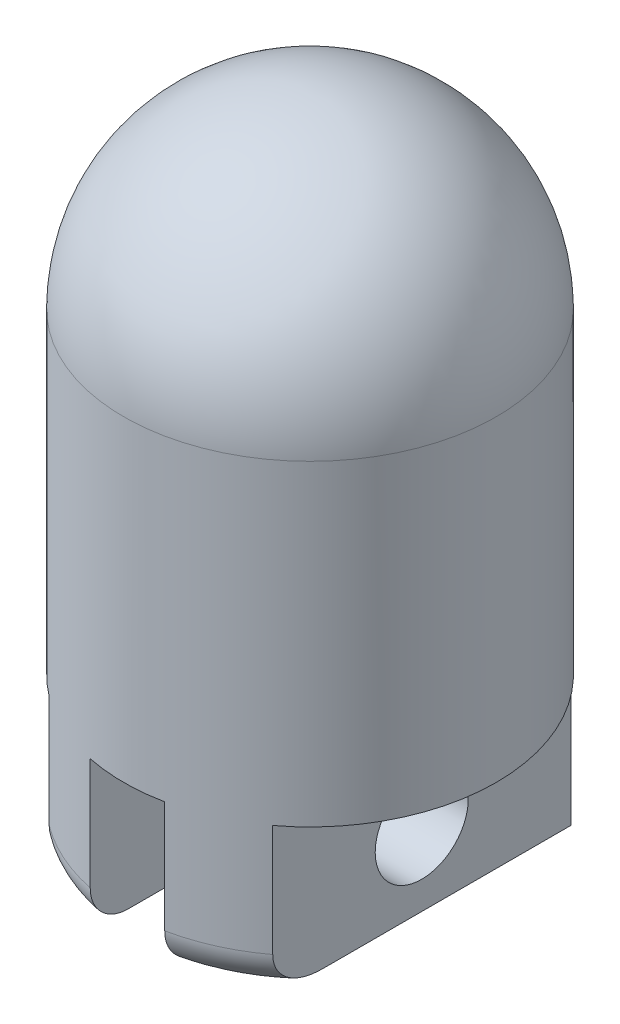
ISO-10303-21;
HEADER;
FILE_DESCRIPTION(('STEP AP214'),'2;1');
FILE_NAME('part.step','',(''),(''),'','','');
FILE_SCHEMA(('AUTOMOTIVE_DESIGN { 1 0 10303 214 1 1 1 1 }'));
ENDSEC;
DATA;
#1=APPLICATION_CONTEXT('core data for automotive mechanical design processes');
#2=APPLICATION_PROTOCOL_DEFINITION('international standard','automotive_design',2000,#1);
#3=PRODUCT_CONTEXT('',#1,'mechanical');
#4=PRODUCT('Part','Part','',(#3));
#5=PRODUCT_RELATED_PRODUCT_CATEGORY('part','',(#4));
#6=PRODUCT_DEFINITION_FORMATION('','',#4);
#7=PRODUCT_DEFINITION_CONTEXT('part definition',#1,'design');
#8=PRODUCT_DEFINITION('design','',#6,#7);
#9=PRODUCT_DEFINITION_SHAPE('','',#8);
#10=(LENGTH_UNIT() NAMED_UNIT(*) SI_UNIT(.MILLI.,.METRE.));
#11=(NAMED_UNIT(*) PLANE_ANGLE_UNIT() SI_UNIT($,.RADIAN.));
#12=(NAMED_UNIT(*) SI_UNIT($,.STERADIAN.) SOLID_ANGLE_UNIT());
#13=UNCERTAINTY_MEASURE_WITH_UNIT(LENGTH_MEASURE(1.E-05),#10,'distance_accuracy_value','');
#14=(GEOMETRIC_REPRESENTATION_CONTEXT(3) GLOBAL_UNCERTAINTY_ASSIGNED_CONTEXT((#13)) GLOBAL_UNIT_ASSIGNED_CONTEXT((#10,
#11,#12)) REPRESENTATION_CONTEXT('',''));
#15=CARTESIAN_POINT('',(0.,0.,0.));
#16=DIRECTION('',(0.,0.,1.));
#17=DIRECTION('',(1.,0.,0.));
#18=AXIS2_PLACEMENT_3D('',#15,#16,#17);
#19=CARTESIAN_POINT('',(0.,0.,0.));
#20=DIRECTION('',(0.,1.,0.));
#21=DIRECTION('',(0.,0.,1.));
#22=AXIS2_PLACEMENT_3D('',#19,#20,#21);
#23=PLANE('',#22);
#24=DIRECTION('',(0.,0.,-1.));
#25=VECTOR('',#24,1.);
#26=CARTESIAN_POINT('',(7.62,0.,10.16));
#27=LINE('',#26,#25);
#28=CARTESIAN_POINT('',(7.62,0.,6.72020833010405));
#29=VERTEX_POINT('',#28);
#30=CARTESIAN_POINT('',(7.62,0.,-10.16));
#31=VERTEX_POINT('',#30);
#32=EDGE_CURVE('E163',#29,#31,#27,.T.);
#33=ORIENTED_EDGE('',*,*,#32,.F.);
#34=CARTESIAN_POINT('',(0.,0.,0.));
#35=DIRECTION('',(0.,1.,0.));
#36=DIRECTION('',(0.,0.,1.));
#37=AXIS2_PLACEMENT_3D('',#34,#35,#36);
#38=CIRCLE('',#37,10.16);
#39=CARTESIAN_POINT('',(2.54,0.,9.83737769936684));
#40=VERTEX_POINT('',#39);
#41=EDGE_CURVE('E285',#29,#40,#38,.F.);
#42=ORIENTED_EDGE('',*,*,#41,.T.);
#43=DIRECTION('',(0.,0.,1.));
#44=VECTOR('',#43,1.);
#45=CARTESIAN_POINT('',(2.54,0.,12.4434078933385));
#46=LINE('',#45,#44);
#47=CARTESIAN_POINT('',(2.54,0.,-12.4434078933385));
#48=VERTEX_POINT('',#47);
#49=EDGE_CURVE('E181',#48,#40,#46,.T.);
#50=ORIENTED_EDGE('',*,*,#49,.F.);
#51=CARTESIAN_POINT('',(0.,0.,0.));
#52=DIRECTION('',(0.,-1.,0.));
#53=DIRECTION('',(0.,0.,-1.));
#54=AXIS2_PLACEMENT_3D('',#51,#52,#53);
#55=CIRCLE('',#54,12.7);
#56=EDGE_CURVE('E212',#48,#31,#55,.T.);
#57=ORIENTED_EDGE('',*,*,#56,.T.);
#58=EDGE_LOOP('',(#33,#42,#50,#57));
#59=FACE_BOUND('',#58,.T.);
#60=ADVANCED_FACE('F39',(#59),#23,.F.);
#61=DIRECTION('',(0.,0.,-1.));
#62=VECTOR('',#61,1.);
#63=CARTESIAN_POINT('',(-2.54,0.,12.4434078933385));
#64=LINE('',#63,#62);
#65=CARTESIAN_POINT('',(-2.54,0.,9.83737769936684));
#66=VERTEX_POINT('',#65);
#67=CARTESIAN_POINT('',(-2.54,0.,-12.4434078933385));
#68=VERTEX_POINT('',#67);
#69=EDGE_CURVE('E155',#66,#68,#64,.T.);
#70=ORIENTED_EDGE('',*,*,#69,.F.);
#71=CARTESIAN_POINT('',(0.,0.,0.));
#72=DIRECTION('',(0.,1.,0.));
#73=DIRECTION('',(0.,0.,1.));
#74=AXIS2_PLACEMENT_3D('',#71,#72,#73);
#75=CIRCLE('',#74,10.16);
#76=CARTESIAN_POINT('',(-7.62,0.,6.72020833010406));
#77=VERTEX_POINT('',#76);
#78=EDGE_CURVE('E234',#66,#77,#75,.F.);
#79=ORIENTED_EDGE('',*,*,#78,.T.);
#80=DIRECTION('',(0.,0.,1.));
#81=VECTOR('',#80,1.);
#82=CARTESIAN_POINT('',(-7.62,0.,10.16));
#83=LINE('',#82,#81);
#84=CARTESIAN_POINT('',(-7.62,0.,-10.16));
#85=VERTEX_POINT('',#84);
#86=EDGE_CURVE('E136',#85,#77,#83,.T.);
#87=ORIENTED_EDGE('',*,*,#86,.F.);
#88=EDGE_CURVE('E151',#85,#68,#55,.T.);
#89=ORIENTED_EDGE('',*,*,#88,.T.);
#90=EDGE_LOOP('',(#70,#79,#87,#89));
#91=FACE_BOUND('',#90,.T.);
#92=ADVANCED_FACE('F337',(#91),#23,.F.);
#93=CARTESIAN_POINT('',(0.,31.75,0.));
#94=DIRECTION('',(0.,-1.,0.));
#95=DIRECTION('',(-1.,0.,0.));
#96=AXIS2_PLACEMENT_3D('',#93,#94,#95);
#97=SPHERICAL_SURFACE('',#96,12.7);
#98=CARTESIAN_POINT('',(0.,31.75,0.));
#99=DIRECTION('',(0.,-1.,0.));
#100=DIRECTION('',(0.,0.,-1.));
#101=AXIS2_PLACEMENT_3D('',#98,#99,#100);
#102=CIRCLE('',#101,12.7);
#103=CARTESIAN_POINT('',(0.,31.75,-12.7));
#104=VERTEX_POINT('',#103);
#105=EDGE_CURVE('E216',#104,#104,#102,.T.);
#106=ORIENTED_EDGE('',*,*,#105,.F.);
#107=EDGE_LOOP('',(#106));
#108=FACE_BOUND('',#107,.T.);
#109=ADVANCED_FACE('F341',(#108),#97,.T.);
#110=CARTESIAN_POINT('',(0.,0.,0.));
#111=DIRECTION('',(0.,-1.,0.));
#112=DIRECTION('',(0.,0.,-1.));
#113=AXIS2_PLACEMENT_3D('',#110,#111,#112);
#114=CYLINDRICAL_SURFACE('',#113,12.7);
#115=DIRECTION('',(0.,-1.,0.));
#116=VECTOR('',#115,1.);
#117=CARTESIAN_POINT('',(-7.62,10.16,10.16));
#118=LINE('',#117,#116);
#119=CARTESIAN_POINT('',(-7.62,10.16,10.16));
#120=VERTEX_POINT('',#119);
#121=CARTESIAN_POINT('',(-7.62,2.54,10.16));
#122=VERTEX_POINT('',#121);
#123=EDGE_CURVE('E143',#120,#122,#118,.T.);
#124=ORIENTED_EDGE('',*,*,#123,.T.);
#125=CARTESIAN_POINT('',(0.,2.54,0.));
#126=DIRECTION('',(0.,1.,0.));
#127=DIRECTION('',(0.,0.,1.));
#128=AXIS2_PLACEMENT_3D('',#125,#126,#127);
#129=CIRCLE('',#128,12.7);
#130=CARTESIAN_POINT('',(-2.54,2.54,12.4434078933385));
#131=VERTEX_POINT('',#130);
#132=EDGE_CURVE('E294',#122,#131,#129,.T.);
#133=ORIENTED_EDGE('',*,*,#132,.T.);
#134=DIRECTION('',(0.,-1.,0.));
#135=VECTOR('',#134,1.);
#136=CARTESIAN_POINT('',(-2.54,10.16,12.4434078933385));
#137=LINE('',#136,#135);
#138=CARTESIAN_POINT('',(-2.54,10.16,12.4434078933385));
#139=VERTEX_POINT('',#138);
#140=EDGE_CURVE('E193',#139,#131,#137,.T.);
#141=ORIENTED_EDGE('',*,*,#140,.F.);
#142=CARTESIAN_POINT('',(0.,10.16,0.));
#143=DIRECTION('',(0.,-1.,0.));
#144=DIRECTION('',(0.,0.,-1.));
#145=AXIS2_PLACEMENT_3D('',#142,#143,#144);
#146=CIRCLE('',#145,12.7);
#147=CARTESIAN_POINT('',(2.54,10.16,12.4434078933385));
#148=VERTEX_POINT('',#147);
#149=EDGE_CURVE('E176',#148,#139,#146,.T.);
#150=ORIENTED_EDGE('',*,*,#149,.F.);
#151=DIRECTION('',(0.,-1.,0.));
#152=VECTOR('',#151,1.);
#153=CARTESIAN_POINT('',(2.54,10.16,12.4434078933385));
#154=LINE('',#153,#152);
#155=CARTESIAN_POINT('',(2.54,2.54,12.4434078933385));
#156=VERTEX_POINT('',#155);
#157=EDGE_CURVE('E199',#148,#156,#154,.T.);
#158=ORIENTED_EDGE('',*,*,#157,.T.);
#159=CARTESIAN_POINT('',(0.,2.54,0.));
#160=DIRECTION('',(0.,1.,0.));
#161=DIRECTION('',(0.,0.,1.));
#162=AXIS2_PLACEMENT_3D('',#159,#160,#161);
#163=CIRCLE('',#162,12.7);
#164=CARTESIAN_POINT('',(7.62,2.54,10.16));
#165=VERTEX_POINT('',#164);
#166=EDGE_CURVE('E246',#156,#165,#163,.T.);
#167=ORIENTED_EDGE('',*,*,#166,.T.);
#168=DIRECTION('',(0.,-1.,0.));
#169=VECTOR('',#168,1.);
#170=CARTESIAN_POINT('',(7.62,10.16,10.16));
#171=LINE('',#170,#169);
#172=CARTESIAN_POINT('',(7.62,10.16,10.16));
#173=VERTEX_POINT('',#172);
#174=EDGE_CURVE('E166',#173,#165,#171,.T.);
#175=ORIENTED_EDGE('',*,*,#174,.F.);
#176=CARTESIAN_POINT('',(0.,10.16,0.));
#177=DIRECTION('',(0.,-1.,0.));
#178=DIRECTION('',(0.,0.,-1.));
#179=AXIS2_PLACEMENT_3D('',#176,#177,#178);
#180=CIRCLE('',#179,12.7);
#181=CARTESIAN_POINT('',(7.62,10.16,-10.16));
#182=VERTEX_POINT('',#181);
#183=EDGE_CURVE('E159',#182,#173,#180,.T.);
#184=ORIENTED_EDGE('',*,*,#183,.F.);
#185=DIRECTION('',(0.,-1.,0.));
#186=VECTOR('',#185,1.);
#187=CARTESIAN_POINT('',(7.62,10.16,-10.16));
#188=LINE('',#187,#186);
#189=EDGE_CURVE('E170',#182,#31,#188,.T.);
#190=ORIENTED_EDGE('',*,*,#189,.T.);
#191=ORIENTED_EDGE('',*,*,#56,.F.);
#192=DIRECTION('',(0.,-1.,0.));
#193=VECTOR('',#192,1.);
#194=CARTESIAN_POINT('',(2.54,10.16,-12.4434078933385));
#195=LINE('',#194,#193);
#196=CARTESIAN_POINT('',(2.54,10.16,-12.4434078933385));
#197=VERTEX_POINT('',#196);
#198=EDGE_CURVE('E203',#197,#48,#195,.T.);
#199=ORIENTED_EDGE('',*,*,#198,.F.);
#200=CARTESIAN_POINT('',(0.,10.16,0.));
#201=DIRECTION('',(0.,-1.,0.));
#202=DIRECTION('',(0.,0.,-1.));
#203=AXIS2_PLACEMENT_3D('',#200,#201,#202);
#204=CIRCLE('',#203,12.7);
#205=CARTESIAN_POINT('',(-2.54,10.16,-12.4434078933385));
#206=VERTEX_POINT('',#205);
#207=EDGE_CURVE('E186',#206,#197,#204,.T.);
#208=ORIENTED_EDGE('',*,*,#207,.F.);
#209=DIRECTION('',(0.,-1.,0.));
#210=VECTOR('',#209,1.);
#211=CARTESIAN_POINT('',(-2.54,10.16,-12.4434078933385));
#212=LINE('',#211,#210);
#213=EDGE_CURVE('E206',#206,#68,#212,.T.);
#214=ORIENTED_EDGE('',*,*,#213,.T.);
#215=ORIENTED_EDGE('',*,*,#88,.F.);
#216=DIRECTION('',(0.,-1.,0.));
#217=VECTOR('',#216,1.);
#218=CARTESIAN_POINT('',(-7.62,10.16,-10.16));
#219=LINE('',#218,#217);
#220=CARTESIAN_POINT('',(-7.62,10.16,-10.16));
#221=VERTEX_POINT('',#220);
#222=EDGE_CURVE('E141',#221,#85,#219,.T.);
#223=ORIENTED_EDGE('',*,*,#222,.F.);
#224=CARTESIAN_POINT('',(0.,10.16,0.));
#225=DIRECTION('',(0.,-1.,0.));
#226=DIRECTION('',(0.,0.,-1.));
#227=AXIS2_PLACEMENT_3D('',#224,#225,#226);
#228=CIRCLE('',#227,12.7);
#229=EDGE_CURVE('E127',#120,#221,#228,.T.);
#230=ORIENTED_EDGE('',*,*,#229,.F.);
#231=EDGE_LOOP('',(#124,#133,#141,#150,#158,#167,#175,#184,#190,#191,#199,#208,#214,#215,#223,#230));
#232=FACE_BOUND('',#231,.T.);
#233=ORIENTED_EDGE('',*,*,#105,.T.);
#234=EDGE_LOOP('',(#233));
#235=FACE_BOUND('',#234,.T.);
#236=ADVANCED_FACE('F147',(#232,#235),#114,.T.);
#237=CARTESIAN_POINT('',(0.,10.16,0.));
#238=DIRECTION('',(0.,-1.,0.));
#239=DIRECTION('',(0.,0.,-1.));
#240=AXIS2_PLACEMENT_3D('',#237,#238,#239);
#241=PLANE('',#240);
#242=CARTESIAN_POINT('',(0.,10.16,0.));
#243=DIRECTION('',(0.,-1.,0.));
#244=DIRECTION('',(0.,0.,-1.));
#245=AXIS2_PLACEMENT_3D('',#242,#243,#244);
#246=CIRCLE('',#245,2.54);
#247=CARTESIAN_POINT('',(-2.54,10.16,0.));
#248=VERTEX_POINT('',#247);
#249=CARTESIAN_POINT('',(2.54,10.16,0.));
#250=VERTEX_POINT('',#249);
#251=EDGE_CURVE('E227',#248,#250,#246,.F.);
#252=ORIENTED_EDGE('',*,*,#251,.T.);
#253=DIRECTION('',(0.,0.,1.));
#254=VECTOR('',#253,1.);
#255=CARTESIAN_POINT('',(2.54,10.16,12.4434078933385));
#256=LINE('',#255,#254);
#257=EDGE_CURVE('E189',#250,#148,#256,.T.);
#258=ORIENTED_EDGE('',*,*,#257,.T.);
#259=ORIENTED_EDGE('',*,*,#149,.T.);
#260=DIRECTION('',(0.,0.,-1.));
#261=VECTOR('',#260,1.);
#262=CARTESIAN_POINT('',(-2.54,10.16,12.4434078933385));
#263=LINE('',#262,#261);
#264=EDGE_CURVE('E182',#139,#248,#263,.T.);
#265=ORIENTED_EDGE('',*,*,#264,.T.);
#266=EDGE_LOOP('',(#252,#258,#259,#265));
#267=FACE_BOUND('',#266,.T.);
#268=ADVANCED_FACE('F267',(#267),#241,.T.);
#269=EDGE_CURVE('E224',#250,#248,#246,.F.);
#270=ORIENTED_EDGE('',*,*,#269,.T.);
#271=EDGE_CURVE('E180',#248,#206,#263,.T.);
#272=ORIENTED_EDGE('',*,*,#271,.T.);
#273=ORIENTED_EDGE('',*,*,#207,.T.);
#274=EDGE_CURVE('E190',#197,#250,#256,.T.);
#275=ORIENTED_EDGE('',*,*,#274,.T.);
#276=EDGE_LOOP('',(#270,#272,#273,#275));
#277=FACE_BOUND('',#276,.T.);
#278=ADVANCED_FACE('F270',(#277),#241,.T.);
#279=CARTESIAN_POINT('',(2.54,10.16,12.4434078933385));
#280=DIRECTION('',(1.,0.,0.));
#281=DIRECTION('',(0.,0.,-1.));
#282=AXIS2_PLACEMENT_3D('',#279,#280,#281);
#283=PLANE('',#282);
#284=CARTESIAN_POINT('',(2.54,5.08,0.));
#285=DIRECTION('',(1.,0.,0.));
#286=DIRECTION('',(0.,0.,-1.));
#287=AXIS2_PLACEMENT_3D('',#284,#285,#286);
#288=CIRCLE('',#287,3.175);
#289=CARTESIAN_POINT('',(2.54,5.08,-3.175));
#290=VERTEX_POINT('',#289);
#291=EDGE_CURVE('E169',#290,#290,#288,.T.);
#292=ORIENTED_EDGE('',*,*,#291,.T.);
#293=EDGE_LOOP('',(#292));
#294=FACE_BOUND('',#293,.T.);
#295=ORIENTED_EDGE('',*,*,#49,.T.);
#296=CARTESIAN_POINT('',(2.54,0.,9.83737769936684));
#297=CARTESIAN_POINT('',(2.54,1.45425618167772E-06,9.91230037919097));
#298=CARTESIAN_POINT('',(2.54,0.00310981694239159,9.98718958698183));
#299=CARTESIAN_POINT('',(2.54,0.0155436658062321,10.1364549391743));
#300=CARTESIAN_POINT('',(2.54,0.02486959755277,10.2108310464197));
#301=CARTESIAN_POINT('',(2.54,0.0621632906921143,10.4324166619154));
#302=CARTESIAN_POINT('',(2.54,0.0994469487679672,10.578173392806));
#303=CARTESIAN_POINT('',(2.54,0.198147270173078,10.8613867869284));
#304=CARTESIAN_POINT('',(2.54,0.259589645281355,10.9988344265028));
#305=CARTESIAN_POINT('',(2.54,0.405105398356876,11.261129326273));
#306=CARTESIAN_POINT('',(2.54,0.48916633258982,11.3859834630861));
#307=CARTESIAN_POINT('',(2.54,0.675862847898282,11.6169487416195));
#308=CARTESIAN_POINT('',(2.54,0.778107822291197,11.7233756291323));
#309=CARTESIAN_POINT('',(2.54,0.999446084232905,11.9170573290163));
#310=CARTESIAN_POINT('',(2.54,1.11854228435804,12.0043088204298));
#311=CARTESIAN_POINT('',(2.54,1.36703211456297,12.1549133561521));
#312=CARTESIAN_POINT('',(2.54,1.49610667508061,12.2187937971196));
#313=CARTESIAN_POINT('',(2.54,1.76323440237714,12.3234975537076));
#314=CARTESIAN_POINT('',(2.54,1.90127928169638,12.3643418234144));
#315=CARTESIAN_POINT('',(2.54,2.12369890518237,12.4097791905788));
#316=CARTESIAN_POINT('',(2.54,2.20651763910892,12.4223841804546));
#317=CARTESIAN_POINT('',(2.54,2.37287781294579,12.4391952140899));
#318=CARTESIAN_POINT('',(2.54,2.45641798662608,12.4434137919833));
#319=CARTESIAN_POINT('',(2.54,2.54,12.4434078933385));
#320=B_SPLINE_CURVE_WITH_KNOTS('',3,(#296,#297,#298,#299,#300,#301,#302,#303,#304,#305,#306,
#307,#308,#309,#310,#311,#312,#313,#314,#315,#316,#317,#318,#319),.UNSPECIFIED.,.F.,.F.,(4,2,2,
2,2,2,2,2,2,2,2,4),(0.,0.224635584073767,0.449287267911123,0.898324217122332,1.34784036920845,
1.79710972118426,2.23769161945873,2.67834976141615,3.10834056745386,3.53793961324235,
3.78887256919796,4.0394302038591),.UNSPECIFIED.);
#321=EDGE_CURVE('E54',#40,#156,#320,.T.);
#322=ORIENTED_EDGE('',*,*,#321,.T.);
#323=ORIENTED_EDGE('',*,*,#157,.F.);
#324=ORIENTED_EDGE('',*,*,#257,.F.);
#325=ORIENTED_EDGE('',*,*,#274,.F.);
#326=ORIENTED_EDGE('',*,*,#198,.T.);
#327=EDGE_LOOP('',(#295,#322,#323,#324,#325,#326));
#328=FACE_BOUND('',#327,.T.);
#329=ADVANCED_FACE('F272',(#294,#328),#283,.F.);
#330=CARTESIAN_POINT('',(-2.54,10.16,12.4434078933385));
#331=DIRECTION('',(-1.,0.,0.));
#332=DIRECTION('',(0.,0.,1.));
#333=AXIS2_PLACEMENT_3D('',#330,#331,#332);
#334=PLANE('',#333);
#335=CARTESIAN_POINT('',(-2.54,5.08,0.));
#336=DIRECTION('',(-1.,0.,0.));
#337=DIRECTION('',(0.,0.,1.));
#338=AXIS2_PLACEMENT_3D('',#335,#336,#337);
#339=CIRCLE('',#338,3.175);
#340=CARTESIAN_POINT('',(-2.54,5.08,3.175));
#341=VERTEX_POINT('',#340);
#342=EDGE_CURVE('E232',#341,#341,#339,.T.);
#343=ORIENTED_EDGE('',*,*,#342,.T.);
#344=EDGE_LOOP('',(#343));
#345=FACE_BOUND('',#344,.T.);
#346=ORIENTED_EDGE('',*,*,#140,.T.);
#347=CARTESIAN_POINT('',(-2.54,2.54,12.4434078933385));
#348=CARTESIAN_POINT('',(-2.54,2.46967063237577,12.4434154470113));
#349=CARTESIAN_POINT('',(-2.54,2.39934485357642,12.4404267278602));
#350=CARTESIAN_POINT('',(-2.54,2.25920319252276,12.4285150367311));
#351=CARTESIAN_POINT('',(-2.54,2.18938726943151,12.4195925454082));
#352=CARTESIAN_POINT('',(-2.54,2.0508429922709,12.3958863873355));
#353=CARTESIAN_POINT('',(-2.54,1.98211338963525,12.3811100493502));
#354=CARTESIAN_POINT('',(-2.54,1.84616156852946,12.3458265144606));
#355=CARTESIAN_POINT('',(-2.54,1.77893934087272,12.3253193524927));
#356=CARTESIAN_POINT('',(-2.54,1.58020157604863,12.2553951049839));
#357=CARTESIAN_POINT('',(-2.54,1.45153515102383,12.1975614990708));
#358=CARTESIAN_POINT('',(-2.54,1.20572174178529,12.0613038825231));
#359=CARTESIAN_POINT('',(-2.54,1.08857431180475,11.982880669105));
#360=CARTESIAN_POINT('',(-2.54,0.867990402614351,11.8070995623068));
#361=CARTESIAN_POINT('',(-2.54,0.764664812840586,11.7096023869722));
#362=CARTESIAN_POINT('',(-2.54,0.575468544765382,11.4989271370242));
#363=CARTESIAN_POINT('',(-2.54,0.489601028382851,11.3857462280823));
#364=CARTESIAN_POINT('',(-2.54,0.335940087501158,11.1446164847891));
#365=CARTESIAN_POINT('',(-2.54,0.268530705758163,11.0164232223069));
#366=CARTESIAN_POINT('',(-2.54,0.155607960316393,10.7507343228132));
#367=CARTESIAN_POINT('',(-2.54,0.110091838523056,10.6132398600497));
#368=CARTESIAN_POINT('',(-2.54,0.0506877983667472,10.3690151979483));
#369=CARTESIAN_POINT('',(-2.54,0.0316698297012548,10.2634985640939));
#370=CARTESIAN_POINT('',(-2.54,0.00632611211670065,10.051121449083));
#371=CARTESIAN_POINT('',(-2.54,-1.98484952771332E-05,9.94426338192671));
#372=CARTESIAN_POINT('',(-2.54,0.,9.83737769936684));
#373=B_SPLINE_CURVE_WITH_KNOTS('',3,(#347,#348,#349,#350,#351,#352,#353,#354,#355,#356,#357,
#358,#359,#360,#361,#362,#363,#364,#365,#366,#367,#368,#369,#370,#371,#372),.UNSPECIFIED.,.F.,
.F.,(4,2,2,2,2,2,2,2,2,2,2,2,4),(0.,0.210918249149259,0.421819415305526,0.632457372480104,
0.843094045585046,1.26412750353444,1.68514466173996,2.10935936996745,2.53365084153177,
2.9661951343593,3.39868492133767,3.71960780058626,4.04001840172957),.UNSPECIFIED.);
#374=EDGE_CURVE('E288',#131,#66,#373,.T.);
#375=ORIENTED_EDGE('',*,*,#374,.T.);
#376=ORIENTED_EDGE('',*,*,#69,.T.);
#377=ORIENTED_EDGE('',*,*,#213,.F.);
#378=ORIENTED_EDGE('',*,*,#271,.F.);
#379=ORIENTED_EDGE('',*,*,#264,.F.);
#380=EDGE_LOOP('',(#346,#375,#376,#377,#378,#379));
#381=FACE_BOUND('',#380,.T.);
#382=ADVANCED_FACE('F255',(#345,#381),#334,.F.);
#383=CARTESIAN_POINT('',(-7.62,10.16,10.16));
#384=DIRECTION('',(1.,0.,0.));
#385=DIRECTION('',(0.,0.,-1.));
#386=AXIS2_PLACEMENT_3D('',#383,#384,#385);
#387=PLANE('',#386);
#388=CARTESIAN_POINT('',(-7.62,5.08,0.));
#389=DIRECTION('',(-1.,0.,0.));
#390=DIRECTION('',(0.,0.,1.));
#391=AXIS2_PLACEMENT_3D('',#388,#389,#390);
#392=CIRCLE('',#391,3.175);
#393=CARTESIAN_POINT('',(-7.62,5.08,3.175));
#394=VERTEX_POINT('',#393);
#395=EDGE_CURVE('E233',#394,#394,#392,.T.);
#396=ORIENTED_EDGE('',*,*,#395,.F.);
#397=EDGE_LOOP('',(#396));
#398=FACE_BOUND('',#397,.T.);
#399=ORIENTED_EDGE('',*,*,#86,.T.);
#400=CARTESIAN_POINT('',(-7.62,0.,6.72020833010406));
#401=CARTESIAN_POINT('',(-7.62,-7.47413466262921E-05,6.99327990287421));
#402=CARTESIAN_POINT('',(-7.62,0.0193476233139782,7.26867863347754));
#403=CARTESIAN_POINT('',(-7.62,0.106175815575614,7.81491676110583));
#404=CARTESIAN_POINT('',(-7.62,0.174158048363266,8.08566098800379));
#405=CARTESIAN_POINT('',(-7.62,0.330202589140558,8.50572625033473));
#406=CARTESIAN_POINT('',(-7.62,0.40038807044519,8.66158064871892));
#407=CARTESIAN_POINT('',(-7.62,0.563805608258863,8.96011014989274));
#408=CARTESIAN_POINT('',(-7.62,0.656936899856236,9.10283922552907));
#409=CARTESIAN_POINT('',(-7.62,0.849628854295138,9.34773236899358));
#410=CARTESIAN_POINT('',(-7.62,0.945607476125319,9.45270636094602));
#411=CARTESIAN_POINT('',(-7.62,1.15378585705436,9.64565066826041));
#412=CARTESIAN_POINT('',(-7.62,1.26599581181159,9.73361021427731));
#413=CARTESIAN_POINT('',(-7.62,1.44529437515778,9.84952483403398));
#414=CARTESIAN_POINT('',(-7.62,1.50721950643727,9.88562806891205));
#415=CARTESIAN_POINT('',(-7.62,1.63422624334214,9.95174325933018));
#416=CARTESIAN_POINT('',(-7.62,1.69930608040803,9.98175857998488));
#417=CARTESIAN_POINT('',(-7.62,1.83201255255219,10.0351448409041));
#418=CARTESIAN_POINT('',(-7.62,1.89963477966944,10.058526730362));
#419=CARTESIAN_POINT('',(-7.62,2.03687651112399,10.0982731683472));
#420=CARTESIAN_POINT('',(-7.62,2.10649472654276,10.1146421412512));
#421=CARTESIAN_POINT('',(-7.62,2.23669220288616,10.1381834984238));
#422=CARTESIAN_POINT('',(-7.62,2.2970923532813,10.1463553862042));
#423=CARTESIAN_POINT('',(-7.62,2.41832511963126,10.157267723823));
#424=CARTESIAN_POINT('',(-7.62,2.47915729303315,10.1600130994335));
#425=CARTESIAN_POINT('',(-7.62,2.54,10.16));
#426=B_SPLINE_CURVE_WITH_KNOTS('',3,(#400,#401,#402,#403,#404,#405,#406,#407,#408,#409,#410,
#411,#412,#413,#414,#415,#416,#417,#418,#419,#420,#421,#422,#423,#424,#425),.UNSPECIFIED.,.F.,
.F.,(4,2,2,2,2,2,2,2,2,2,2,2,4),(0.,0.822329418337462,1.6545856392476,2.16562723963451,
2.67446343320547,3.09953770525556,3.52488015523,3.73965037300011,3.95430155034069,
4.16859633351735,4.38275572052489,4.5653690206287,4.74781648210551),.UNSPECIFIED.);
#427=EDGE_CURVE('E238',#77,#122,#426,.T.);
#428=ORIENTED_EDGE('',*,*,#427,.T.);
#429=ORIENTED_EDGE('',*,*,#123,.F.);
#430=DIRECTION('',(0.,0.,1.));
#431=VECTOR('',#430,1.);
#432=CARTESIAN_POINT('',(-7.62,10.16,10.16));
#433=LINE('',#432,#431);
#434=EDGE_CURVE('E130',#221,#120,#433,.T.);
#435=ORIENTED_EDGE('',*,*,#434,.F.);
#436=ORIENTED_EDGE('',*,*,#222,.T.);
#437=EDGE_LOOP('',(#399,#428,#429,#435,#436));
#438=FACE_BOUND('',#437,.T.);
#439=ADVANCED_FACE('F140',(#398,#438),#387,.F.);
#440=CARTESIAN_POINT('',(0.,10.16,0.));
#441=DIRECTION('',(0.,-1.,0.));
#442=DIRECTION('',(0.,0.,-1.));
#443=AXIS2_PLACEMENT_3D('',#440,#441,#442);
#444=PLANE('',#443);
#445=ORIENTED_EDGE('',*,*,#229,.T.);
#446=ORIENTED_EDGE('',*,*,#434,.T.);
#447=EDGE_LOOP('',(#445,#446));
#448=FACE_BOUND('',#447,.T.);
#449=ADVANCED_FACE('F129',(#448),#444,.T.);
#450=CARTESIAN_POINT('',(7.62,10.16,10.16));
#451=DIRECTION('',(-1.,0.,0.));
#452=DIRECTION('',(0.,0.,1.));
#453=AXIS2_PLACEMENT_3D('',#450,#451,#452);
#454=PLANE('',#453);
#455=CARTESIAN_POINT('',(7.62,5.08,0.));
#456=DIRECTION('',(-1.,0.,0.));
#457=DIRECTION('',(0.,0.,1.));
#458=AXIS2_PLACEMENT_3D('',#455,#456,#457);
#459=CIRCLE('',#458,3.175);
#460=CARTESIAN_POINT('',(7.62,5.08,3.175));
#461=VERTEX_POINT('',#460);
#462=EDGE_CURVE('E228',#461,#461,#459,.T.);
#463=ORIENTED_EDGE('',*,*,#462,.T.);
#464=EDGE_LOOP('',(#463));
#465=FACE_BOUND('',#464,.T.);
#466=ORIENTED_EDGE('',*,*,#174,.T.);
#467=CARTESIAN_POINT('',(7.62,2.54,10.16));
#468=CARTESIAN_POINT('',(7.62,2.47932871801413,10.160013422572));
#469=CARTESIAN_POINT('',(7.62,2.41866415701389,10.1572831063146));
#470=CARTESIAN_POINT('',(7.62,2.2978418724177,10.1464377967899));
#471=CARTESIAN_POINT('',(7.62,2.2376839558966,10.138324956614));
#472=CARTESIAN_POINT('',(7.62,2.11862855106172,10.1168730079301));
#473=CARTESIAN_POINT('',(7.62,2.05972614470898,10.1035612158783));
#474=CARTESIAN_POINT('',(7.62,1.94330175148668,10.0719120039639));
#475=CARTESIAN_POINT('',(7.62,1.88577984067071,10.0535743079047));
#476=CARTESIAN_POINT('',(7.62,1.71602141232677,9.99141574586202));
#477=CARTESIAN_POINT('',(7.62,1.60633792199534,9.94040237008355));
#478=CARTESIAN_POINT('',(7.62,1.39643687655324,9.82166143509588));
#479=CARTESIAN_POINT('',(7.62,1.29623012032819,9.75391511838246));
#480=CARTESIAN_POINT('',(7.62,1.10140396209762,9.60017195503882));
#481=CARTESIAN_POINT('',(7.62,1.00743968410422,9.51334813782557));
#482=CARTESIAN_POINT('',(7.62,0.832811559060196,9.32739554876275));
#483=CARTESIAN_POINT('',(7.62,0.752146257718207,9.22826812443807));
#484=CARTESIAN_POINT('',(7.62,0.569010350138093,8.97113171733957));
#485=CARTESIAN_POINT('',(7.62,0.474380686677985,8.80751855999478));
#486=CARTESIAN_POINT('',(7.62,0.312580853764836,8.46662437064915));
#487=CARTESIAN_POINT('',(7.62,0.245548144629361,8.28928002390191));
#488=CARTESIAN_POINT('',(7.62,0.123485313346866,7.8824169338836));
#489=CARTESIAN_POINT('',(7.62,0.0755124919327644,7.6508331222634));
#490=CARTESIAN_POINT('',(7.62,0.0139793253253003,7.18584265831651));
#491=CARTESIAN_POINT('',(7.62,1.01513079262639E-05,6.95249184834465));
#492=CARTESIAN_POINT('',(7.62,0.,6.72020833010406));
#493=B_SPLINE_CURVE_WITH_KNOTS('',3,(#467,#468,#469,#470,#471,#472,#473,#474,#475,#476,#477,
#478,#479,#480,#481,#482,#483,#484,#485,#486,#487,#488,#489,#490,#491,#492),.UNSPECIFIED.,.F.,
.F.,(4,2,2,2,2,2,2,2,2,2,2,2,4),(0.,0.181941273273647,0.363809811116228,0.544735355538571,
0.725670844648792,1.08677612239183,1.44828804845431,1.83064058095025,2.21295127403602,
2.77684806807465,3.34352060408733,4.05019972676753,4.74833947495295),.UNSPECIFIED.);
#494=EDGE_CURVE('E11',#165,#29,#493,.T.);
#495=ORIENTED_EDGE('',*,*,#494,.T.);
#496=ORIENTED_EDGE('',*,*,#32,.T.);
#497=ORIENTED_EDGE('',*,*,#189,.F.);
#498=DIRECTION('',(0.,0.,-1.));
#499=VECTOR('',#498,1.);
#500=CARTESIAN_POINT('',(7.62,10.16,10.16));
#501=LINE('',#500,#499);
#502=EDGE_CURVE('E162',#173,#182,#501,.T.);
#503=ORIENTED_EDGE('',*,*,#502,.F.);
#504=EDGE_LOOP('',(#466,#495,#496,#497,#503));
#505=FACE_BOUND('',#504,.T.);
#506=ADVANCED_FACE('F261',(#465,#505),#454,.F.);
#507=CARTESIAN_POINT('',(0.,10.16,0.));
#508=DIRECTION('',(0.,-1.,0.));
#509=DIRECTION('',(0.,0.,-1.));
#510=AXIS2_PLACEMENT_3D('',#507,#508,#509);
#511=PLANE('',#510);
#512=ORIENTED_EDGE('',*,*,#183,.T.);
#513=ORIENTED_EDGE('',*,*,#502,.T.);
#514=EDGE_LOOP('',(#512,#513));
#515=FACE_BOUND('',#514,.T.);
#516=ADVANCED_FACE('F258',(#515),#511,.T.);
#517=CARTESIAN_POINT('',(0.,0.,0.));
#518=DIRECTION('',(0.,-1.,0.));
#519=DIRECTION('',(0.,0.,-1.));
#520=AXIS2_PLACEMENT_3D('',#517,#518,#519);
#521=CYLINDRICAL_SURFACE('',#520,2.54);
#522=CARTESIAN_POINT('',(0.,22.86,0.));
#523=DIRECTION('',(0.,-1.,0.));
#524=DIRECTION('',(0.,0.,-1.));
#525=AXIS2_PLACEMENT_3D('',#522,#523,#524);
#526=CIRCLE('',#525,2.54);
#527=CARTESIAN_POINT('',(0.,22.86,-2.54));
#528=VERTEX_POINT('',#527);
#529=EDGE_CURVE('E220',#528,#528,#526,.T.);
#530=ORIENTED_EDGE('',*,*,#529,.F.);
#531=EDGE_LOOP('',(#530));
#532=FACE_BOUND('',#531,.T.);
#533=ORIENTED_EDGE('',*,*,#251,.F.);
#534=ORIENTED_EDGE('',*,*,#269,.F.);
#535=EDGE_LOOP('',(#533,#534));
#536=FACE_BOUND('',#535,.T.);
#537=ADVANCED_FACE('F260',(#532,#536),#521,.F.);
#538=CARTESIAN_POINT('',(0.,31.75,0.));
#539=DIRECTION('',(0.,-1.,0.));
#540=DIRECTION('',(-1.,0.,0.));
#541=AXIS2_PLACEMENT_3D('',#538,#539,#540);
#542=SPHERICAL_SURFACE('',#541,9.24573955938626);
#543=ORIENTED_EDGE('',*,*,#529,.T.);
#544=EDGE_LOOP('',(#543));
#545=FACE_BOUND('',#544,.T.);
#546=ADVANCED_FACE('F326',(#545),#542,.F.);
#547=CARTESIAN_POINT('',(12.7,5.08,0.));
#548=DIRECTION('',(-1.,0.,0.));
#549=DIRECTION('',(0.,0.,1.));
#550=AXIS2_PLACEMENT_3D('',#547,#548,#549);
#551=CYLINDRICAL_SURFACE('',#550,3.175);
#552=ORIENTED_EDGE('',*,*,#462,.F.);
#553=EDGE_LOOP('',(#552));
#554=FACE_BOUND('',#553,.T.);
#555=ORIENTED_EDGE('',*,*,#291,.F.);
#556=EDGE_LOOP('',(#555));
#557=FACE_BOUND('',#556,.T.);
#558=ADVANCED_FACE('F332',(#554,#557),#551,.F.);
#559=ORIENTED_EDGE('',*,*,#395,.T.);
#560=EDGE_LOOP('',(#559));
#561=FACE_BOUND('',#560,.T.);
#562=ORIENTED_EDGE('',*,*,#342,.F.);
#563=EDGE_LOOP('',(#562));
#564=FACE_BOUND('',#563,.T.);
#565=ADVANCED_FACE('F364',(#561,#564),#551,.F.);
#566=CARTESIAN_POINT('',(0.,2.54,0.));
#567=DIRECTION('',(0.,1.,0.));
#568=DIRECTION('',(0.,0.,1.));
#569=AXIS2_PLACEMENT_3D('',#566,#567,#568);
#570=TOROIDAL_SURFACE('',#569,10.16,2.54);
#571=ORIENTED_EDGE('',*,*,#374,.F.);
#572=ORIENTED_EDGE('',*,*,#132,.F.);
#573=ORIENTED_EDGE('',*,*,#427,.F.);
#574=ORIENTED_EDGE('',*,*,#78,.F.);
#575=EDGE_LOOP('',(#571,#572,#573,#574));
#576=FACE_BOUND('',#575,.T.);
#577=ADVANCED_FACE('F248',(#576),#570,.T.);
#578=CARTESIAN_POINT('',(0.,2.54,0.));
#579=DIRECTION('',(0.,1.,0.));
#580=DIRECTION('',(0.,0.,1.));
#581=AXIS2_PLACEMENT_3D('',#578,#579,#580);
#582=TOROIDAL_SURFACE('',#581,10.16,2.54);
#583=ORIENTED_EDGE('',*,*,#494,.F.);
#584=ORIENTED_EDGE('',*,*,#166,.F.);
#585=ORIENTED_EDGE('',*,*,#321,.F.);
#586=ORIENTED_EDGE('',*,*,#41,.F.);
#587=EDGE_LOOP('',(#583,#584,#585,#586));
#588=FACE_BOUND('',#587,.T.);
#589=ADVANCED_FACE('F41',(#588),#582,.T.);
#590=CLOSED_SHELL('',(#60,#92,#109,#236,#268,#278,#329,#382,#439,#449,#506,#516,#537,#546,#558,
#565,#577,#589));
#591=MANIFOLD_SOLID_BREP('B2',#590);
#592=ADVANCED_BREP_SHAPE_REPRESENTATION('',(#18,#591),#14);
#593=SHAPE_DEFINITION_REPRESENTATION(#9,#592);
ENDSEC;
END-ISO-10303-21;
